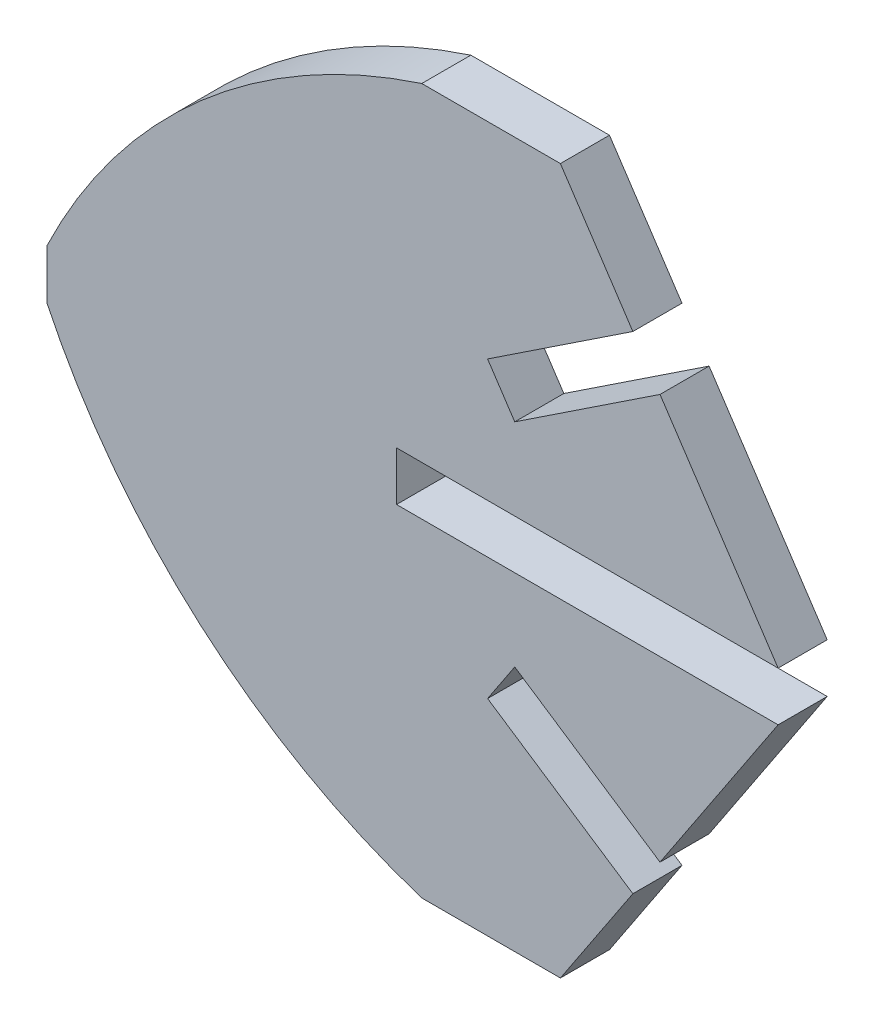
ISO-10303-21;
HEADER;
FILE_DESCRIPTION(('STEP AP214'),'2;1');
FILE_NAME('part.step','',(''),(''),'','','');
FILE_SCHEMA(('AUTOMOTIVE_DESIGN { 1 0 10303 214 1 1 1 1 }'));
ENDSEC;
DATA;
#1=APPLICATION_CONTEXT('core data for automotive mechanical design processes');
#2=APPLICATION_PROTOCOL_DEFINITION('international standard','automotive_design',2000,#1);
#3=PRODUCT_CONTEXT('',#1,'mechanical');
#4=PRODUCT('Part','Part','',(#3));
#5=PRODUCT_RELATED_PRODUCT_CATEGORY('part','',(#4));
#6=PRODUCT_DEFINITION_FORMATION('','',#4);
#7=PRODUCT_DEFINITION_CONTEXT('part definition',#1,'design');
#8=PRODUCT_DEFINITION('design','',#6,#7);
#9=PRODUCT_DEFINITION_SHAPE('','',#8);
#10=(LENGTH_UNIT() NAMED_UNIT(*) SI_UNIT(.MILLI.,.METRE.));
#11=(NAMED_UNIT(*) PLANE_ANGLE_UNIT() SI_UNIT($,.RADIAN.));
#12=(NAMED_UNIT(*) SI_UNIT($,.STERADIAN.) SOLID_ANGLE_UNIT());
#13=UNCERTAINTY_MEASURE_WITH_UNIT(LENGTH_MEASURE(1.E-05),#10,'distance_accuracy_value','');
#14=(GEOMETRIC_REPRESENTATION_CONTEXT(3) GLOBAL_UNCERTAINTY_ASSIGNED_CONTEXT((#13)) GLOBAL_UNIT_ASSIGNED_CONTEXT((#10,
#11,#12)) REPRESENTATION_CONTEXT('',''));
#15=CARTESIAN_POINT('',(0.,0.,0.));
#16=DIRECTION('',(0.,0.,1.));
#17=DIRECTION('',(1.,0.,0.));
#18=AXIS2_PLACEMENT_3D('',#15,#16,#17);
#19=CARTESIAN_POINT('',(90.4592220185718,-1.524,1.524));
#20=DIRECTION('',(-1.,0.,0.));
#21=DIRECTION('',(0.,0.,1.));
#22=AXIS2_PLACEMENT_3D('',#19,#20,#21);
#23=PLANE('',#22);
#24=DIRECTION('',(0.,1.,0.));
#25=VECTOR('',#24,1.);
#26=CARTESIAN_POINT('',(90.4592220185718,-1.524,0.));
#27=LINE('',#26,#25);
#28=CARTESIAN_POINT('',(90.4592220185718,-1.524,0.));
#29=VERTEX_POINT('',#28);
#30=CARTESIAN_POINT('',(90.4592220185718,0.,0.));
#31=VERTEX_POINT('',#30);
#32=EDGE_CURVE('E189',#29,#31,#27,.T.);
#33=ORIENTED_EDGE('',*,*,#32,.T.);
#34=DIRECTION('',(0.,0.,-1.));
#35=VECTOR('',#34,1.);
#36=CARTESIAN_POINT('',(90.4592220185718,0.,1.524));
#37=LINE('',#36,#35);
#38=CARTESIAN_POINT('',(90.4592220185718,0.,1.524));
#39=VERTEX_POINT('',#38);
#40=EDGE_CURVE('E11',#39,#31,#37,.T.);
#41=ORIENTED_EDGE('',*,*,#40,.F.);
#42=DIRECTION('',(0.,1.,0.));
#43=VECTOR('',#42,1.);
#44=CARTESIAN_POINT('',(90.4592220185718,-1.524,1.524));
#45=LINE('',#44,#43);
#46=CARTESIAN_POINT('',(90.4592220185718,-1.524,1.524));
#47=VERTEX_POINT('',#46);
#48=EDGE_CURVE('E223',#47,#39,#45,.T.);
#49=ORIENTED_EDGE('',*,*,#48,.F.);
#50=DIRECTION('',(0.,0.,-1.));
#51=VECTOR('',#50,1.);
#52=CARTESIAN_POINT('',(90.4592220185718,-1.524,1.524));
#53=LINE('',#52,#51);
#54=EDGE_CURVE('E185',#47,#29,#53,.T.);
#55=ORIENTED_EDGE('',*,*,#54,.T.);
#56=EDGE_LOOP('',(#33,#41,#49,#55));
#57=FACE_BOUND('',#56,.T.);
#58=ADVANCED_FACE('F33',(#57),#23,.F.);
#59=CARTESIAN_POINT('',(90.4592220185718,0.,1.524));
#60=DIRECTION('',(0.,1.,0.));
#61=DIRECTION('',(0.,0.,1.));
#62=AXIS2_PLACEMENT_3D('',#59,#60,#61);
#63=PLANE('',#62);
#64=DIRECTION('',(1.,0.,0.));
#65=VECTOR('',#64,1.);
#66=CARTESIAN_POINT('',(90.4592220185718,0.,0.));
#67=LINE('',#66,#65);
#68=CARTESIAN_POINT('',(102.307099067161,0.,0.));
#69=VERTEX_POINT('',#68);
#70=EDGE_CURVE('E192',#31,#69,#67,.T.);
#71=ORIENTED_EDGE('',*,*,#70,.T.);
#72=DIRECTION('',(0.,0.,-1.));
#73=VECTOR('',#72,1.);
#74=CARTESIAN_POINT('',(102.307099067161,0.,1.524));
#75=LINE('',#74,#73);
#76=CARTESIAN_POINT('',(102.307099067161,0.,1.524));
#77=VERTEX_POINT('',#76);
#78=EDGE_CURVE('E41',#77,#69,#75,.T.);
#79=ORIENTED_EDGE('',*,*,#78,.F.);
#80=DIRECTION('',(1.,0.,0.));
#81=VECTOR('',#80,1.);
#82=CARTESIAN_POINT('',(90.4592220185718,0.,1.524));
#83=LINE('',#82,#81);
#84=EDGE_CURVE('E122',#39,#77,#83,.T.);
#85=ORIENTED_EDGE('',*,*,#84,.F.);
#86=ORIENTED_EDGE('',*,*,#40,.T.);
#87=EDGE_LOOP('',(#71,#79,#85,#86));
#88=FACE_BOUND('',#87,.T.);
#89=ADVANCED_FACE('F331',(#88),#63,.F.);
#90=CARTESIAN_POINT('',(102.307099067161,0.,1.524));
#91=DIRECTION('',(-0.833270604063531,-0.552865354678332,0.));
#92=DIRECTION('',(0.552865354678332,-0.833270604063531,0.));
#93=AXIS2_PLACEMENT_3D('',#90,#91,#92);
#94=PLANE('',#93);
#95=DIRECTION('',(-0.552865354678332,0.833270604063531,0.));
#96=VECTOR('',#95,1.);
#97=CARTESIAN_POINT('',(102.307099067161,0.,0.));
#98=LINE('',#97,#96);
#99=CARTESIAN_POINT('',(98.6402742475765,5.5265849208227,0.));
#100=VERTEX_POINT('',#99);
#101=EDGE_CURVE('E194',#69,#100,#98,.T.);
#102=ORIENTED_EDGE('',*,*,#101,.T.);
#103=DIRECTION('',(0.,0.,-1.));
#104=VECTOR('',#103,1.);
#105=CARTESIAN_POINT('',(98.6402742475765,5.5265849208227,1.524));
#106=LINE('',#105,#104);
#107=CARTESIAN_POINT('',(98.6402742475765,5.5265849208227,1.524));
#108=VERTEX_POINT('',#107);
#109=EDGE_CURVE('E260',#108,#100,#106,.T.);
#110=ORIENTED_EDGE('',*,*,#109,.F.);
#111=DIRECTION('',(-0.552865354678332,0.833270604063531,0.));
#112=VECTOR('',#111,1.);
#113=CARTESIAN_POINT('',(102.307099067161,0.,1.524));
#114=LINE('',#113,#112);
#115=EDGE_CURVE('E268',#77,#108,#114,.T.);
#116=ORIENTED_EDGE('',*,*,#115,.F.);
#117=ORIENTED_EDGE('',*,*,#78,.T.);
#118=EDGE_LOOP('',(#102,#110,#116,#117));
#119=FACE_BOUND('',#118,.T.);
#120=ADVANCED_FACE('F266',(#119),#94,.F.);
#121=CARTESIAN_POINT('',(98.6402742475765,5.5265849208227,1.524));
#122=DIRECTION('',(0.552865354678331,-0.833270604063531,0.));
#123=DIRECTION('',(0.833270604063532,0.552865354678331,0.));
#124=AXIS2_PLACEMENT_3D('',#121,#122,#123);
#125=PLANE('',#124);
#126=DIRECTION('',(-0.833270604063532,-0.552865354678331,0.));
#127=VECTOR('',#126,1.);
#128=CARTESIAN_POINT('',(98.6402742475765,5.5265849208227,0.));
#129=LINE('',#128,#127);
#130=CARTESIAN_POINT('',(94.1296918710026,2.53386597301707,0.));
#131=VERTEX_POINT('',#130);
#132=EDGE_CURVE('E196',#100,#131,#129,.T.);
#133=ORIENTED_EDGE('',*,*,#132,.T.);
#134=DIRECTION('',(0.,0.,-1.));
#135=VECTOR('',#134,1.);
#136=CARTESIAN_POINT('',(94.1296918710026,2.53386597301707,1.524));
#137=LINE('',#136,#135);
#138=CARTESIAN_POINT('',(94.1296918710026,2.53386597301707,1.524));
#139=VERTEX_POINT('',#138);
#140=EDGE_CURVE('E257',#139,#131,#137,.T.);
#141=ORIENTED_EDGE('',*,*,#140,.F.);
#142=DIRECTION('',(-0.833270604063532,-0.552865354678331,0.));
#143=VECTOR('',#142,1.);
#144=CARTESIAN_POINT('',(98.6402742475765,5.5265849208227,1.524));
#145=LINE('',#144,#143);
#146=EDGE_CURVE('E286',#108,#139,#145,.T.);
#147=ORIENTED_EDGE('',*,*,#146,.F.);
#148=ORIENTED_EDGE('',*,*,#109,.T.);
#149=EDGE_LOOP('',(#133,#141,#147,#148));
#150=FACE_BOUND('',#149,.T.);
#151=ADVANCED_FACE('F277',(#150),#125,.F.);
#152=CARTESIAN_POINT('',(94.1296918710026,2.53386597301707,1.524));
#153=DIRECTION('',(-0.833270604063533,-0.552865354678329,0.));
#154=DIRECTION('',(0.552865354678329,-0.833270604063533,0.));
#155=AXIS2_PLACEMENT_3D('',#152,#153,#154);
#156=PLANE('',#155);
#157=DIRECTION('',(-0.552865354678329,0.833270604063533,0.));
#158=VECTOR('',#157,1.);
#159=CARTESIAN_POINT('',(94.1296918710026,2.53386597301707,0.));
#160=LINE('',#159,#158);
#161=CARTESIAN_POINT('',(93.2871250704728,3.80377037360989,0.));
#162=VERTEX_POINT('',#161);
#163=EDGE_CURVE('E198',#131,#162,#160,.T.);
#164=ORIENTED_EDGE('',*,*,#163,.T.);
#165=DIRECTION('',(0.,0.,-1.));
#166=VECTOR('',#165,1.);
#167=CARTESIAN_POINT('',(93.2871250704728,3.80377037360989,1.524));
#168=LINE('',#167,#166);
#169=CARTESIAN_POINT('',(93.2871250704728,3.80377037360989,1.524));
#170=VERTEX_POINT('',#169);
#171=EDGE_CURVE('E254',#170,#162,#168,.T.);
#172=ORIENTED_EDGE('',*,*,#171,.F.);
#173=DIRECTION('',(-0.552865354678329,0.833270604063533,0.));
#174=VECTOR('',#173,1.);
#175=CARTESIAN_POINT('',(94.1296918710026,2.53386597301707,1.524));
#176=LINE('',#175,#174);
#177=EDGE_CURVE('E283',#139,#170,#176,.T.);
#178=ORIENTED_EDGE('',*,*,#177,.F.);
#179=ORIENTED_EDGE('',*,*,#140,.T.);
#180=EDGE_LOOP('',(#164,#172,#178,#179));
#181=FACE_BOUND('',#180,.T.);
#182=ADVANCED_FACE('F281',(#181),#156,.F.);
#183=CARTESIAN_POINT('',(97.7977074470467,6.79648932141552,1.524));
#184=DIRECTION('',(-0.552865354678332,0.833270604063531,0.));
#185=DIRECTION('',(-0.833270604063531,-0.552865354678332,0.));
#186=AXIS2_PLACEMENT_3D('',#183,#184,#185);
#187=PLANE('',#186);
#188=DIRECTION('',(0.833270604063531,0.552865354678332,0.));
#189=VECTOR('',#188,1.);
#190=CARTESIAN_POINT('',(97.7977074470467,6.79648932141552,0.));
#191=LINE('',#190,#189);
#192=CARTESIAN_POINT('',(97.7977074470467,6.79648932141552,0.));
#193=VERTEX_POINT('',#192);
#194=EDGE_CURVE('E200',#162,#193,#191,.T.);
#195=ORIENTED_EDGE('',*,*,#194,.T.);
#196=DIRECTION('',(0.,0.,-1.));
#197=VECTOR('',#196,1.);
#198=CARTESIAN_POINT('',(97.7977074470467,6.79648932141552,1.524));
#199=LINE('',#198,#197);
#200=CARTESIAN_POINT('',(97.7977074470467,6.79648932141552,1.524));
#201=VERTEX_POINT('',#200);
#202=EDGE_CURVE('E251',#201,#193,#199,.T.);
#203=ORIENTED_EDGE('',*,*,#202,.F.);
#204=DIRECTION('',(0.833270604063531,0.552865354678332,0.));
#205=VECTOR('',#204,1.);
#206=CARTESIAN_POINT('',(97.7977074470467,6.79648932141552,1.524));
#207=LINE('',#206,#205);
#208=EDGE_CURVE('E285',#170,#201,#207,.T.);
#209=ORIENTED_EDGE('',*,*,#208,.F.);
#210=ORIENTED_EDGE('',*,*,#171,.T.);
#211=EDGE_LOOP('',(#195,#203,#209,#210));
#212=FACE_BOUND('',#211,.T.);
#213=ADVANCED_FACE('F344',(#212),#187,.F.);
#214=CARTESIAN_POINT('',(97.7977074470467,6.79648932141552,1.524));
#215=DIRECTION('',(-0.833270604063531,-0.552865354678332,0.));
#216=DIRECTION('',(0.552865354678332,-0.833270604063531,0.));
#217=AXIS2_PLACEMENT_3D('',#214,#215,#216);
#218=PLANE('',#217);
#219=DIRECTION('',(-0.552865354678332,0.833270604063531,0.));
#220=VECTOR('',#219,1.);
#221=CARTESIAN_POINT('',(97.7977074470467,6.79648932141552,0.));
#222=LINE('',#221,#220);
#223=CARTESIAN_POINT('',(95.547284867564,10.1882934312874,0.));
#224=VERTEX_POINT('',#223);
#225=EDGE_CURVE('E202',#193,#224,#222,.T.);
#226=ORIENTED_EDGE('',*,*,#225,.T.);
#227=DIRECTION('',(0.,0.,-1.));
#228=VECTOR('',#227,1.);
#229=CARTESIAN_POINT('',(95.547284867564,10.1882934312874,1.524));
#230=LINE('',#229,#228);
#231=CARTESIAN_POINT('',(95.547284867564,10.1882934312874,1.524));
#232=VERTEX_POINT('',#231);
#233=EDGE_CURVE('E248',#232,#224,#230,.T.);
#234=ORIENTED_EDGE('',*,*,#233,.F.);
#235=DIRECTION('',(-0.552865354678332,0.833270604063531,0.));
#236=VECTOR('',#235,1.);
#237=CARTESIAN_POINT('',(97.7977074470467,6.79648932141552,1.524));
#238=LINE('',#237,#236);
#239=EDGE_CURVE('E288',#201,#232,#238,.T.);
#240=ORIENTED_EDGE('',*,*,#239,.F.);
#241=ORIENTED_EDGE('',*,*,#202,.T.);
#242=EDGE_LOOP('',(#226,#234,#240,#241));
#243=FACE_BOUND('',#242,.T.);
#244=ADVANCED_FACE('F347',(#243),#218,.F.);
#245=CARTESIAN_POINT('',(95.547284867564,10.1882934312874,1.524));
#246=DIRECTION('',(0.,-1.,0.));
#247=DIRECTION('',(0.,0.,-1.));
#248=AXIS2_PLACEMENT_3D('',#245,#246,#247);
#249=PLANE('',#248);
#250=DIRECTION('',(-1.,0.,0.));
#251=VECTOR('',#250,1.);
#252=CARTESIAN_POINT('',(95.547284867564,10.1882934312874,0.));
#253=LINE('',#252,#251);
#254=CARTESIAN_POINT('',(91.2426302086544,10.1882934312874,0.));
#255=VERTEX_POINT('',#254);
#256=EDGE_CURVE('E204',#224,#255,#253,.T.);
#257=ORIENTED_EDGE('',*,*,#256,.T.);
#258=DIRECTION('',(0.,0.,-1.));
#259=VECTOR('',#258,1.);
#260=CARTESIAN_POINT('',(91.2426302086544,10.1882934312874,1.524));
#261=LINE('',#260,#259);
#262=CARTESIAN_POINT('',(91.2426302086544,10.1882934312874,1.524));
#263=VERTEX_POINT('',#262);
#264=EDGE_CURVE('E245',#263,#255,#261,.T.);
#265=ORIENTED_EDGE('',*,*,#264,.F.);
#266=DIRECTION('',(-1.,0.,0.));
#267=VECTOR('',#266,1.);
#268=CARTESIAN_POINT('',(95.547284867564,10.1882934312874,1.524));
#269=LINE('',#268,#267);
#270=EDGE_CURVE('E294',#232,#263,#269,.T.);
#271=ORIENTED_EDGE('',*,*,#270,.F.);
#272=ORIENTED_EDGE('',*,*,#233,.T.);
#273=EDGE_LOOP('',(#257,#265,#271,#272));
#274=FACE_BOUND('',#273,.T.);
#275=ADVANCED_FACE('F351',(#274),#249,.F.);
#276=CARTESIAN_POINT('',(97.2950053516386,-8.47372664609218,1.524));
#277=DIRECTION('',(0.,0.,-1.));
#278=DIRECTION('',(-1.,0.,0.));
#279=AXIS2_PLACEMENT_3D('',#276,#277,#278);
#280=CYLINDRICAL_SURFACE('',#279,19.6189255118605);
#281=CARTESIAN_POINT('',(97.2950053516386,-8.47372664609218,0.));
#282=DIRECTION('',(0.,0.,1.));
#283=DIRECTION('',(1.,0.,0.));
#284=AXIS2_PLACEMENT_3D('',#281,#282,#283);
#285=CIRCLE('',#284,19.6189255118605);
#286=CARTESIAN_POINT('',(79.6004244024542,0.,0.));
#287=VERTEX_POINT('',#286);
#288=EDGE_CURVE('E206',#255,#287,#285,.T.);
#289=ORIENTED_EDGE('',*,*,#288,.T.);
#290=DIRECTION('',(0.,0.,-1.));
#291=VECTOR('',#290,1.);
#292=CARTESIAN_POINT('',(79.6004244024542,0.,1.524));
#293=LINE('',#292,#291);
#294=CARTESIAN_POINT('',(79.6004244024542,0.,1.524));
#295=VERTEX_POINT('',#294);
#296=EDGE_CURVE('E242',#295,#287,#293,.T.);
#297=ORIENTED_EDGE('',*,*,#296,.F.);
#298=CARTESIAN_POINT('',(97.2950053516386,-8.47372664609218,1.524));
#299=DIRECTION('',(0.,0.,1.));
#300=DIRECTION('',(1.,0.,0.));
#301=AXIS2_PLACEMENT_3D('',#298,#299,#300);
#302=CIRCLE('',#301,19.6189255118605);
#303=EDGE_CURVE('E296',#263,#295,#302,.T.);
#304=ORIENTED_EDGE('',*,*,#303,.F.);
#305=ORIENTED_EDGE('',*,*,#264,.T.);
#306=EDGE_LOOP('',(#289,#297,#304,#305));
#307=FACE_BOUND('',#306,.T.);
#308=ADVANCED_FACE('F355',(#307),#280,.T.);
#309=CARTESIAN_POINT('',(79.6004244024542,-1.524,1.524));
#310=DIRECTION('',(1.,0.,0.));
#311=DIRECTION('',(0.,0.,-1.));
#312=AXIS2_PLACEMENT_3D('',#309,#310,#311);
#313=PLANE('',#312);
#314=DIRECTION('',(0.,-1.,0.));
#315=VECTOR('',#314,1.);
#316=CARTESIAN_POINT('',(79.6004244024542,-1.524,0.));
#317=LINE('',#316,#315);
#318=CARTESIAN_POINT('',(79.6004244024542,-1.52400000000001,0.));
#319=VERTEX_POINT('',#318);
#320=EDGE_CURVE('E208',#287,#319,#317,.T.);
#321=ORIENTED_EDGE('',*,*,#320,.T.);
#322=DIRECTION('',(0.,0.,-1.));
#323=VECTOR('',#322,1.);
#324=CARTESIAN_POINT('',(79.6004244024542,-1.52400000000001,1.524));
#325=LINE('',#324,#323);
#326=CARTESIAN_POINT('',(79.6004244024542,-1.52400000000001,1.524));
#327=VERTEX_POINT('',#326);
#328=EDGE_CURVE('E239',#327,#319,#325,.T.);
#329=ORIENTED_EDGE('',*,*,#328,.F.);
#330=DIRECTION('',(0.,-1.,0.));
#331=VECTOR('',#330,1.);
#332=CARTESIAN_POINT('',(79.6004244024542,-1.524,1.524));
#333=LINE('',#332,#331);
#334=EDGE_CURVE('E298',#295,#327,#333,.T.);
#335=ORIENTED_EDGE('',*,*,#334,.F.);
#336=ORIENTED_EDGE('',*,*,#296,.T.);
#337=EDGE_LOOP('',(#321,#329,#335,#336));
#338=FACE_BOUND('',#337,.T.);
#339=ADVANCED_FACE('F359',(#338),#313,.F.);
#340=CARTESIAN_POINT('',(97.2950053516386,6.94972664609218,1.524));
#341=DIRECTION('',(0.,0.,-1.));
#342=DIRECTION('',(-1.,0.,0.));
#343=AXIS2_PLACEMENT_3D('',#340,#341,#342);
#344=CYLINDRICAL_SURFACE('',#343,19.6189255118605);
#345=CARTESIAN_POINT('',(97.2950053516386,6.94972664609218,0.));
#346=DIRECTION('',(0.,0.,1.));
#347=DIRECTION('',(-1.,0.,0.));
#348=AXIS2_PLACEMENT_3D('',#345,#346,#347);
#349=CIRCLE('',#348,19.6189255118605);
#350=CARTESIAN_POINT('',(91.2426302086544,-11.7122934312874,0.));
#351=VERTEX_POINT('',#350);
#352=EDGE_CURVE('E210',#319,#351,#349,.T.);
#353=ORIENTED_EDGE('',*,*,#352,.T.);
#354=DIRECTION('',(0.,0.,-1.));
#355=VECTOR('',#354,1.);
#356=CARTESIAN_POINT('',(91.2426302086544,-11.7122934312874,1.524));
#357=LINE('',#356,#355);
#358=CARTESIAN_POINT('',(91.2426302086544,-11.7122934312874,1.524));
#359=VERTEX_POINT('',#358);
#360=EDGE_CURVE('E236',#359,#351,#357,.T.);
#361=ORIENTED_EDGE('',*,*,#360,.F.);
#362=CARTESIAN_POINT('',(97.2950053516386,6.94972664609218,1.524));
#363=DIRECTION('',(0.,0.,1.));
#364=DIRECTION('',(-1.,0.,0.));
#365=AXIS2_PLACEMENT_3D('',#362,#363,#364);
#366=CIRCLE('',#365,19.6189255118605);
#367=EDGE_CURVE('E300',#327,#359,#366,.T.);
#368=ORIENTED_EDGE('',*,*,#367,.F.);
#369=ORIENTED_EDGE('',*,*,#328,.T.);
#370=EDGE_LOOP('',(#353,#361,#368,#369));
#371=FACE_BOUND('',#370,.T.);
#372=ADVANCED_FACE('F363',(#371),#344,.T.);
#373=CARTESIAN_POINT('',(95.547284867564,-11.7122934312874,1.524));
#374=DIRECTION('',(0.,1.,0.));
#375=DIRECTION('',(0.,0.,1.));
#376=AXIS2_PLACEMENT_3D('',#373,#374,#375);
#377=PLANE('',#376);
#378=DIRECTION('',(1.,0.,0.));
#379=VECTOR('',#378,1.);
#380=CARTESIAN_POINT('',(95.547284867564,-11.7122934312874,0.));
#381=LINE('',#380,#379);
#382=CARTESIAN_POINT('',(95.547284867564,-11.7122934312874,0.));
#383=VERTEX_POINT('',#382);
#384=EDGE_CURVE('E212',#351,#383,#381,.T.);
#385=ORIENTED_EDGE('',*,*,#384,.T.);
#386=DIRECTION('',(0.,0.,-1.));
#387=VECTOR('',#386,1.);
#388=CARTESIAN_POINT('',(95.547284867564,-11.7122934312874,1.524));
#389=LINE('',#388,#387);
#390=CARTESIAN_POINT('',(95.547284867564,-11.7122934312874,1.524));
#391=VERTEX_POINT('',#390);
#392=EDGE_CURVE('E233',#391,#383,#389,.T.);
#393=ORIENTED_EDGE('',*,*,#392,.F.);
#394=DIRECTION('',(1.,0.,0.));
#395=VECTOR('',#394,1.);
#396=CARTESIAN_POINT('',(95.547284867564,-11.7122934312874,1.524));
#397=LINE('',#396,#395);
#398=EDGE_CURVE('E302',#359,#391,#397,.T.);
#399=ORIENTED_EDGE('',*,*,#398,.F.);
#400=ORIENTED_EDGE('',*,*,#360,.T.);
#401=EDGE_LOOP('',(#385,#393,#399,#400));
#402=FACE_BOUND('',#401,.T.);
#403=ADVANCED_FACE('F367',(#402),#377,.F.);
#404=CARTESIAN_POINT('',(97.7977074470467,-8.32048932141552,1.524));
#405=DIRECTION('',(-0.833270604063531,0.552865354678332,0.));
#406=DIRECTION('',(-0.552865354678332,-0.833270604063531,0.));
#407=AXIS2_PLACEMENT_3D('',#404,#405,#406);
#408=PLANE('',#407);
#409=DIRECTION('',(0.552865354678332,0.833270604063531,0.));
#410=VECTOR('',#409,1.);
#411=CARTESIAN_POINT('',(97.7977074470467,-8.32048932141552,0.));
#412=LINE('',#411,#410);
#413=CARTESIAN_POINT('',(97.7977074470467,-8.32048932141552,0.));
#414=VERTEX_POINT('',#413);
#415=EDGE_CURVE('E214',#383,#414,#412,.T.);
#416=ORIENTED_EDGE('',*,*,#415,.T.);
#417=DIRECTION('',(0.,0.,-1.));
#418=VECTOR('',#417,1.);
#419=CARTESIAN_POINT('',(97.7977074470467,-8.32048932141552,1.524));
#420=LINE('',#419,#418);
#421=CARTESIAN_POINT('',(97.7977074470467,-8.32048932141552,1.524));
#422=VERTEX_POINT('',#421);
#423=EDGE_CURVE('E230',#422,#414,#420,.T.);
#424=ORIENTED_EDGE('',*,*,#423,.F.);
#425=DIRECTION('',(0.552865354678332,0.833270604063531,0.));
#426=VECTOR('',#425,1.);
#427=CARTESIAN_POINT('',(97.7977074470467,-8.32048932141552,1.524));
#428=LINE('',#427,#426);
#429=EDGE_CURVE('E304',#391,#422,#428,.T.);
#430=ORIENTED_EDGE('',*,*,#429,.F.);
#431=ORIENTED_EDGE('',*,*,#392,.T.);
#432=EDGE_LOOP('',(#416,#424,#430,#431));
#433=FACE_BOUND('',#432,.T.);
#434=ADVANCED_FACE('F371',(#433),#408,.F.);
#435=CARTESIAN_POINT('',(97.7977074470467,-8.32048932141552,1.524));
#436=DIRECTION('',(-0.552865354678332,-0.833270604063531,0.));
#437=DIRECTION('',(0.833270604063531,-0.552865354678332,0.));
#438=AXIS2_PLACEMENT_3D('',#435,#436,#437);
#439=PLANE('',#438);
#440=DIRECTION('',(-0.833270604063531,0.552865354678332,0.));
#441=VECTOR('',#440,1.);
#442=CARTESIAN_POINT('',(97.7977074470467,-8.32048932141552,0.));
#443=LINE('',#442,#441);
#444=CARTESIAN_POINT('',(93.2871250704728,-5.32777037360989,0.));
#445=VERTEX_POINT('',#444);
#446=EDGE_CURVE('E216',#414,#445,#443,.T.);
#447=ORIENTED_EDGE('',*,*,#446,.T.);
#448=DIRECTION('',(0.,0.,-1.));
#449=VECTOR('',#448,1.);
#450=CARTESIAN_POINT('',(93.2871250704728,-5.32777037360989,1.524));
#451=LINE('',#450,#449);
#452=CARTESIAN_POINT('',(93.2871250704728,-5.32777037360989,1.524));
#453=VERTEX_POINT('',#452);
#454=EDGE_CURVE('E227',#453,#445,#451,.T.);
#455=ORIENTED_EDGE('',*,*,#454,.F.);
#456=DIRECTION('',(-0.833270604063531,0.552865354678332,0.));
#457=VECTOR('',#456,1.);
#458=CARTESIAN_POINT('',(97.7977074470467,-8.32048932141552,1.524));
#459=LINE('',#458,#457);
#460=EDGE_CURVE('E306',#422,#453,#459,.T.);
#461=ORIENTED_EDGE('',*,*,#460,.F.);
#462=ORIENTED_EDGE('',*,*,#423,.T.);
#463=EDGE_LOOP('',(#447,#455,#461,#462));
#464=FACE_BOUND('',#463,.T.);
#465=ADVANCED_FACE('F312',(#464),#439,.F.);
#466=CARTESIAN_POINT('',(94.1296918710026,-4.05786597301707,1.524));
#467=DIRECTION('',(-0.833270604063533,0.552865354678329,0.));
#468=DIRECTION('',(-0.552865354678329,-0.833270604063533,0.));
#469=AXIS2_PLACEMENT_3D('',#466,#467,#468);
#470=PLANE('',#469);
#471=DIRECTION('',(0.552865354678329,0.833270604063533,0.));
#472=VECTOR('',#471,1.);
#473=CARTESIAN_POINT('',(94.1296918710026,-4.05786597301707,0.));
#474=LINE('',#473,#472);
#475=CARTESIAN_POINT('',(94.1296918710026,-4.05786597301707,0.));
#476=VERTEX_POINT('',#475);
#477=EDGE_CURVE('E218',#445,#476,#474,.T.);
#478=ORIENTED_EDGE('',*,*,#477,.T.);
#479=DIRECTION('',(0.,0.,-1.));
#480=VECTOR('',#479,1.);
#481=CARTESIAN_POINT('',(94.1296918710026,-4.05786597301707,1.524));
#482=LINE('',#481,#480);
#483=CARTESIAN_POINT('',(94.1296918710026,-4.05786597301707,1.524));
#484=VERTEX_POINT('',#483);
#485=EDGE_CURVE('E180',#484,#476,#482,.T.);
#486=ORIENTED_EDGE('',*,*,#485,.F.);
#487=DIRECTION('',(0.552865354678329,0.833270604063533,0.));
#488=VECTOR('',#487,1.);
#489=CARTESIAN_POINT('',(94.1296918710026,-4.05786597301707,1.524));
#490=LINE('',#489,#488);
#491=EDGE_CURVE('E171',#453,#484,#490,.T.);
#492=ORIENTED_EDGE('',*,*,#491,.F.);
#493=ORIENTED_EDGE('',*,*,#454,.T.);
#494=EDGE_LOOP('',(#478,#486,#492,#493));
#495=FACE_BOUND('',#494,.T.);
#496=ADVANCED_FACE('F316',(#495),#470,.F.);
#497=CARTESIAN_POINT('',(98.6402742475765,-7.0505849208227,1.524));
#498=DIRECTION('',(0.552865354678331,0.833270604063531,0.));
#499=DIRECTION('',(-0.833270604063532,0.552865354678332,0.));
#500=AXIS2_PLACEMENT_3D('',#497,#498,#499);
#501=PLANE('',#500);
#502=DIRECTION('',(0.833270604063531,-0.552865354678331,0.));
#503=VECTOR('',#502,1.);
#504=CARTESIAN_POINT('',(98.6402742475765,-7.0505849208227,0.));
#505=LINE('',#504,#503);
#506=CARTESIAN_POINT('',(98.6402742475765,-7.0505849208227,0.));
#507=VERTEX_POINT('',#506);
#508=EDGE_CURVE('E179',#476,#507,#505,.T.);
#509=ORIENTED_EDGE('',*,*,#508,.T.);
#510=DIRECTION('',(0.,0.,-1.));
#511=VECTOR('',#510,1.);
#512=CARTESIAN_POINT('',(98.6402742475765,-7.0505849208227,1.524));
#513=LINE('',#512,#511);
#514=CARTESIAN_POINT('',(98.6402742475765,-7.0505849208227,1.524));
#515=VERTEX_POINT('',#514);
#516=EDGE_CURVE('E176',#515,#507,#513,.T.);
#517=ORIENTED_EDGE('',*,*,#516,.F.);
#518=DIRECTION('',(0.833270604063531,-0.552865354678331,0.));
#519=VECTOR('',#518,1.);
#520=CARTESIAN_POINT('',(98.6402742475765,-7.0505849208227,1.524));
#521=LINE('',#520,#519);
#522=EDGE_CURVE('E165',#484,#515,#521,.T.);
#523=ORIENTED_EDGE('',*,*,#522,.F.);
#524=ORIENTED_EDGE('',*,*,#485,.T.);
#525=EDGE_LOOP('',(#509,#517,#523,#524));
#526=FACE_BOUND('',#525,.T.);
#527=ADVANCED_FACE('F177',(#526),#501,.F.);
#528=CARTESIAN_POINT('',(102.307099067161,-1.524,1.524));
#529=DIRECTION('',(-0.833270604063531,0.552865354678332,0.));
#530=DIRECTION('',(-0.552865354678332,-0.833270604063531,0.));
#531=AXIS2_PLACEMENT_3D('',#528,#529,#530);
#532=PLANE('',#531);
#533=DIRECTION('',(0.552865354678332,0.833270604063531,0.));
#534=VECTOR('',#533,1.);
#535=CARTESIAN_POINT('',(102.307099067161,-1.524,0.));
#536=LINE('',#535,#534);
#537=CARTESIAN_POINT('',(102.307099067161,-1.524,0.));
#538=VERTEX_POINT('',#537);
#539=EDGE_CURVE('E108',#507,#538,#536,.T.);
#540=ORIENTED_EDGE('',*,*,#539,.T.);
#541=DIRECTION('',(0.,0.,-1.));
#542=VECTOR('',#541,1.);
#543=CARTESIAN_POINT('',(102.307099067161,-1.524,1.524));
#544=LINE('',#543,#542);
#545=CARTESIAN_POINT('',(102.307099067161,-1.524,1.524));
#546=VERTEX_POINT('',#545);
#547=EDGE_CURVE('E181',#546,#538,#544,.T.);
#548=ORIENTED_EDGE('',*,*,#547,.F.);
#549=DIRECTION('',(0.552865354678332,0.833270604063531,0.));
#550=VECTOR('',#549,1.);
#551=CARTESIAN_POINT('',(102.307099067161,-1.524,1.524));
#552=LINE('',#551,#550);
#553=EDGE_CURVE('E169',#515,#546,#552,.T.);
#554=ORIENTED_EDGE('',*,*,#553,.F.);
#555=ORIENTED_EDGE('',*,*,#516,.T.);
#556=EDGE_LOOP('',(#540,#548,#554,#555));
#557=FACE_BOUND('',#556,.T.);
#558=ADVANCED_FACE('F183',(#557),#532,.F.);
#559=CARTESIAN_POINT('',(90.4592220185718,-1.524,1.524));
#560=DIRECTION('',(0.,-1.,0.));
#561=DIRECTION('',(0.,0.,-1.));
#562=AXIS2_PLACEMENT_3D('',#559,#560,#561);
#563=PLANE('',#562);
#564=DIRECTION('',(-1.,0.,0.));
#565=VECTOR('',#564,1.);
#566=CARTESIAN_POINT('',(90.4592220185718,-1.524,0.));
#567=LINE('',#566,#565);
#568=EDGE_CURVE('E114',#538,#29,#567,.T.);
#569=ORIENTED_EDGE('',*,*,#568,.T.);
#570=ORIENTED_EDGE('',*,*,#54,.F.);
#571=DIRECTION('',(-1.,0.,0.));
#572=VECTOR('',#571,1.);
#573=CARTESIAN_POINT('',(90.4592220185718,-1.524,1.524));
#574=LINE('',#573,#572);
#575=EDGE_CURVE('E49',#546,#47,#574,.T.);
#576=ORIENTED_EDGE('',*,*,#575,.F.);
#577=ORIENTED_EDGE('',*,*,#547,.T.);
#578=EDGE_LOOP('',(#569,#570,#576,#577));
#579=FACE_BOUND('',#578,.T.);
#580=ADVANCED_FACE('F320',(#579),#563,.F.);
#581=CARTESIAN_POINT('',(97.2950053516386,-8.47372664609218,1.524));
#582=DIRECTION('',(0.,0.,1.));
#583=DIRECTION('',(1.,0.,0.));
#584=AXIS2_PLACEMENT_3D('',#581,#582,#583);
#585=PLANE('',#584);
#586=ORIENTED_EDGE('',*,*,#48,.T.);
#587=ORIENTED_EDGE('',*,*,#84,.T.);
#588=ORIENTED_EDGE('',*,*,#115,.T.);
#589=ORIENTED_EDGE('',*,*,#146,.T.);
#590=ORIENTED_EDGE('',*,*,#177,.T.);
#591=ORIENTED_EDGE('',*,*,#208,.T.);
#592=ORIENTED_EDGE('',*,*,#239,.T.);
#593=ORIENTED_EDGE('',*,*,#270,.T.);
#594=ORIENTED_EDGE('',*,*,#303,.T.);
#595=ORIENTED_EDGE('',*,*,#334,.T.);
#596=ORIENTED_EDGE('',*,*,#367,.T.);
#597=ORIENTED_EDGE('',*,*,#398,.T.);
#598=ORIENTED_EDGE('',*,*,#429,.T.);
#599=ORIENTED_EDGE('',*,*,#460,.T.);
#600=ORIENTED_EDGE('',*,*,#491,.T.);
#601=ORIENTED_EDGE('',*,*,#522,.T.);
#602=ORIENTED_EDGE('',*,*,#553,.T.);
#603=ORIENTED_EDGE('',*,*,#575,.T.);
#604=EDGE_LOOP('',(#586,#587,#588,#589,#590,#591,#592,#593,#594,#595,#596,#597,#598,#599,#600,
#601,#602,#603));
#605=FACE_BOUND('',#604,.T.);
#606=ADVANCED_FACE('F167',(#605),#585,.T.);
#607=CARTESIAN_POINT('',(97.2950053516386,-8.47372664609218,0.));
#608=DIRECTION('',(0.,0.,1.));
#609=DIRECTION('',(1.,0.,0.));
#610=AXIS2_PLACEMENT_3D('',#607,#608,#609);
#611=PLANE('',#610);
#612=ORIENTED_EDGE('',*,*,#32,.F.);
#613=ORIENTED_EDGE('',*,*,#568,.F.);
#614=ORIENTED_EDGE('',*,*,#539,.F.);
#615=ORIENTED_EDGE('',*,*,#508,.F.);
#616=ORIENTED_EDGE('',*,*,#477,.F.);
#617=ORIENTED_EDGE('',*,*,#446,.F.);
#618=ORIENTED_EDGE('',*,*,#415,.F.);
#619=ORIENTED_EDGE('',*,*,#384,.F.);
#620=ORIENTED_EDGE('',*,*,#352,.F.);
#621=ORIENTED_EDGE('',*,*,#320,.F.);
#622=ORIENTED_EDGE('',*,*,#288,.F.);
#623=ORIENTED_EDGE('',*,*,#256,.F.);
#624=ORIENTED_EDGE('',*,*,#225,.F.);
#625=ORIENTED_EDGE('',*,*,#194,.F.);
#626=ORIENTED_EDGE('',*,*,#163,.F.);
#627=ORIENTED_EDGE('',*,*,#132,.F.);
#628=ORIENTED_EDGE('',*,*,#101,.F.);
#629=ORIENTED_EDGE('',*,*,#70,.F.);
#630=EDGE_LOOP('',(#612,#613,#614,#615,#616,#617,#618,#619,#620,#621,#622,#623,#624,#625,#626,
#627,#628,#629));
#631=FACE_BOUND('',#630,.T.);
#632=ADVANCED_FACE('F272',(#631),#611,.F.);
#633=CLOSED_SHELL('',(#58,#89,#120,#151,#182,#213,#244,#275,#308,#339,#372,#403,#434,#465,#496,
#527,#558,#580,#606,#632));
#634=MANIFOLD_SOLID_BREP('B2',#633);
#635=ADVANCED_BREP_SHAPE_REPRESENTATION('',(#18,#634),#14);
#636=SHAPE_DEFINITION_REPRESENTATION(#9,#635);
ENDSEC;
END-ISO-10303-21;
